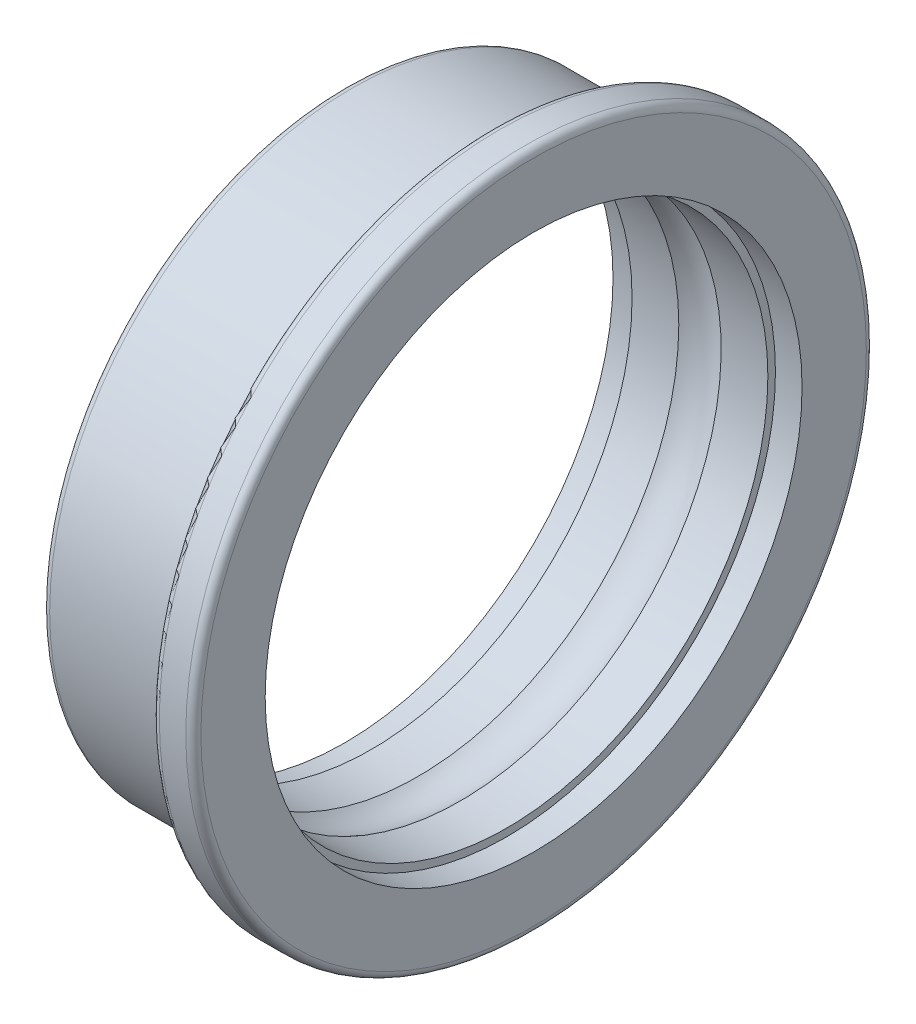
ISO-10303-21;
HEADER;
FILE_DESCRIPTION(('STEP AP214'),'2;1');
FILE_NAME('part.step','',(''),(''),'','','');
FILE_SCHEMA(('AUTOMOTIVE_DESIGN { 1 0 10303 214 1 1 1 1 }'));
ENDSEC;
DATA;
#1=APPLICATION_CONTEXT('core data for automotive mechanical design processes');
#2=APPLICATION_PROTOCOL_DEFINITION('international standard','automotive_design',2000,#1);
#3=PRODUCT_CONTEXT('',#1,'mechanical');
#4=PRODUCT('Part','Part','',(#3));
#5=PRODUCT_RELATED_PRODUCT_CATEGORY('part','',(#4));
#6=PRODUCT_DEFINITION_FORMATION('','',#4);
#7=PRODUCT_DEFINITION_CONTEXT('part definition',#1,'design');
#8=PRODUCT_DEFINITION('design','',#6,#7);
#9=PRODUCT_DEFINITION_SHAPE('','',#8);
#10=(LENGTH_UNIT() NAMED_UNIT(*) SI_UNIT(.MILLI.,.METRE.));
#11=(NAMED_UNIT(*) PLANE_ANGLE_UNIT() SI_UNIT($,.RADIAN.));
#12=(NAMED_UNIT(*) SI_UNIT($,.STERADIAN.) SOLID_ANGLE_UNIT());
#13=UNCERTAINTY_MEASURE_WITH_UNIT(LENGTH_MEASURE(1.E-05),#10,'distance_accuracy_value','');
#14=(GEOMETRIC_REPRESENTATION_CONTEXT(3) GLOBAL_UNCERTAINTY_ASSIGNED_CONTEXT((#13)) GLOBAL_UNIT_ASSIGNED_CONTEXT((#10,
#11,#12)) REPRESENTATION_CONTEXT('',''));
#15=CARTESIAN_POINT('',(0.,0.,0.));
#16=DIRECTION('',(0.,0.,1.));
#17=DIRECTION('',(1.,0.,0.));
#18=AXIS2_PLACEMENT_3D('',#15,#16,#17);
#19=CARTESIAN_POINT('',(4.296,0.,-7.));
#20=DIRECTION('',(1.,0.,0.));
#21=DIRECTION('',(0.,0.,-1.));
#22=AXIS2_PLACEMENT_3D('',#19,#20,#21);
#23=PLANE('',#22);
#24=CARTESIAN_POINT('',(4.296,0.,0.));
#25=DIRECTION('',(-1.,0.,0.));
#26=DIRECTION('',(0.,0.,1.));
#27=AXIS2_PLACEMENT_3D('',#24,#25,#26);
#28=CIRCLE('',#27,7.1);
#29=CARTESIAN_POINT('',(4.296,0.,7.1));
#30=VERTEX_POINT('',#29);
#31=EDGE_CURVE('E115',#30,#30,#28,.F.);
#32=ORIENTED_EDGE('',*,*,#31,.T.);
#33=EDGE_LOOP('',(#32));
#34=FACE_BOUND('',#33,.T.);
#35=CARTESIAN_POINT('',(4.296,0.,0.));
#36=DIRECTION('',(-1.,0.,0.));
#37=DIRECTION('',(0.,0.,1.));
#38=AXIS2_PLACEMENT_3D('',#35,#36,#37);
#39=CIRCLE('',#38,6.9);
#40=CARTESIAN_POINT('',(4.296,0.,6.9));
#41=VERTEX_POINT('',#40);
#42=EDGE_CURVE('E118',#41,#41,#39,.T.);
#43=ORIENTED_EDGE('',*,*,#42,.T.);
#44=EDGE_LOOP('',(#43));
#45=FACE_BOUND('',#44,.T.);
#46=ADVANCED_FACE('F17',(#34,#45),#23,.T.);
#47=CARTESIAN_POINT('',(3.67798113775753,0.,0.));
#48=DIRECTION('',(-1.,0.,0.));
#49=DIRECTION('',(0.,0.,1.));
#50=AXIS2_PLACEMENT_3D('',#47,#48,#49);
#51=CYLINDRICAL_SURFACE('',#50,6.9);
#52=CARTESIAN_POINT('',(3.05996227551506,0.,0.));
#53=DIRECTION('',(1.,0.,0.));
#54=DIRECTION('',(0.,1.,0.));
#55=AXIS2_PLACEMENT_3D('',#52,#53,#54);
#56=CIRCLE('',#55,6.9);
#57=CARTESIAN_POINT('',(3.05996227551506,6.9,0.));
#58=VERTEX_POINT('',#57);
#59=EDGE_CURVE('E73',#58,#58,#56,.F.);
#60=ORIENTED_EDGE('',*,*,#59,.T.);
#61=EDGE_LOOP('',(#60));
#62=FACE_BOUND('',#61,.T.);
#63=ORIENTED_EDGE('',*,*,#42,.F.);
#64=EDGE_LOOP('',(#63));
#65=FACE_BOUND('',#64,.T.);
#66=ADVANCED_FACE('F375',(#62,#65),#51,.F.);
#67=CARTESIAN_POINT('',(4.648,0.,0.));
#68=DIRECTION('',(-1.,0.,0.));
#69=DIRECTION('',(0.,0.,1.));
#70=AXIS2_PLACEMENT_3D('',#67,#68,#69);
#71=CYLINDRICAL_SURFACE('',#70,7.1);
#72=ORIENTED_EDGE('',*,*,#31,.F.);
#73=EDGE_LOOP('',(#72));
#74=FACE_BOUND('',#73,.T.);
#75=CARTESIAN_POINT('',(5.,0.,0.));
#76=DIRECTION('',(-1.,0.,0.));
#77=DIRECTION('',(0.,0.,1.));
#78=AXIS2_PLACEMENT_3D('',#75,#76,#77);
#79=CIRCLE('',#78,7.1);
#80=CARTESIAN_POINT('',(5.,0.,7.1));
#81=VERTEX_POINT('',#80);
#82=EDGE_CURVE('E59',#81,#81,#79,.T.);
#83=ORIENTED_EDGE('',*,*,#82,.F.);
#84=EDGE_LOOP('',(#83));
#85=FACE_BOUND('',#84,.T.);
#86=ADVANCED_FACE('F367',(#74,#85),#71,.F.);
#87=CARTESIAN_POINT('',(5.,0.,-7.95));
#88=DIRECTION('',(1.,0.,0.));
#89=DIRECTION('',(0.,0.,-1.));
#90=AXIS2_PLACEMENT_3D('',#87,#88,#89);
#91=PLANE('',#90);
#92=CARTESIAN_POINT('',(5.,0.,0.));
#93=DIRECTION('',(-1.,0.,0.));
#94=DIRECTION('',(0.,0.,1.));
#95=AXIS2_PLACEMENT_3D('',#92,#93,#94);
#96=CIRCLE('',#95,8.8);
#97=CARTESIAN_POINT('',(5.,0.,8.8));
#98=VERTEX_POINT('',#97);
#99=CARTESIAN_POINT('',(5.,0.,-8.8));
#100=VERTEX_POINT('',#99);
#101=EDGE_CURVE('E51',#98,#100,#96,.T.);
#102=ORIENTED_EDGE('',*,*,#101,.F.);
#103=CARTESIAN_POINT('',(5.,0.,0.));
#104=DIRECTION('',(-1.,0.,0.));
#105=DIRECTION('',(0.,0.,-1.));
#106=AXIS2_PLACEMENT_3D('',#103,#104,#105);
#107=CIRCLE('',#106,8.8);
#108=EDGE_CURVE('E57',#100,#98,#107,.T.);
#109=ORIENTED_EDGE('',*,*,#108,.F.);
#110=EDGE_LOOP('',(#102,#109));
#111=FACE_BOUND('',#110,.T.);
#112=ORIENTED_EDGE('',*,*,#82,.T.);
#113=EDGE_LOOP('',(#112));
#114=FACE_BOUND('',#113,.T.);
#115=ADVANCED_FACE('F55',(#111,#114),#91,.T.);
#116=CARTESIAN_POINT('',(2.5,0.,0.));
#117=DIRECTION('',(1.,0.,0.));
#118=DIRECTION('',(0.,1.,0.));
#119=AXIS2_PLACEMENT_3D('',#116,#117,#118);
#120=TOROIDAL_SURFACE('',#119,5.9625,1.092);
#121=ORIENTED_EDGE('',*,*,#59,.F.);
#122=EDGE_LOOP('',(#121));
#123=FACE_BOUND('',#122,.T.);
#124=CARTESIAN_POINT('',(1.94003772448494,0.,0.));
#125=DIRECTION('',(-1.,0.,0.));
#126=DIRECTION('',(0.,0.,1.));
#127=AXIS2_PLACEMENT_3D('',#124,#125,#126);
#128=CIRCLE('',#127,6.9);
#129=CARTESIAN_POINT('',(1.94003772448494,0.,6.9));
#130=VERTEX_POINT('',#129);
#131=EDGE_CURVE('E64',#130,#130,#128,.T.);
#132=ORIENTED_EDGE('',*,*,#131,.T.);
#133=EDGE_LOOP('',(#132));
#134=FACE_BOUND('',#133,.T.);
#135=ADVANCED_FACE('F86',(#123,#134),#120,.F.);
#136=CARTESIAN_POINT('',(4.8,0.,0.));
#137=DIRECTION('',(1.,0.,0.));
#138=DIRECTION('',(0.,1.,0.));
#139=AXIS2_PLACEMENT_3D('',#136,#137,#138);
#140=TOROIDAL_SURFACE('',#139,8.8,0.2);
#141=CARTESIAN_POINT('',(4.8,0.,0.));
#142=DIRECTION('',(-1.,0.,0.));
#143=DIRECTION('',(0.,0.,1.));
#144=AXIS2_PLACEMENT_3D('',#141,#142,#143);
#145=CIRCLE('',#144,9.);
#146=CARTESIAN_POINT('',(4.8,0.,9.));
#147=VERTEX_POINT('',#146);
#148=EDGE_CURVE('E93',#147,#147,#145,.T.);
#149=ORIENTED_EDGE('',*,*,#148,.F.);
#150=EDGE_LOOP('',(#149));
#151=FACE_BOUND('',#150,.T.);
#152=ORIENTED_EDGE('',*,*,#108,.T.);
#153=ORIENTED_EDGE('',*,*,#101,.T.);
#154=EDGE_LOOP('',(#152,#153));
#155=FACE_BOUND('',#154,.T.);
#156=ADVANCED_FACE('F63',(#151,#155),#140,.T.);
#157=CARTESIAN_POINT('',(1.32201886224247,0.,0.));
#158=DIRECTION('',(-1.,0.,0.));
#159=DIRECTION('',(0.,0.,1.));
#160=AXIS2_PLACEMENT_3D('',#157,#158,#159);
#161=CYLINDRICAL_SURFACE('',#160,6.9);
#162=CARTESIAN_POINT('',(0.704,0.,0.));
#163=DIRECTION('',(-1.,0.,0.));
#164=DIRECTION('',(0.,0.,1.));
#165=AXIS2_PLACEMENT_3D('',#162,#163,#164);
#166=CIRCLE('',#165,6.9);
#167=CARTESIAN_POINT('',(0.704,0.,6.9));
#168=VERTEX_POINT('',#167);
#169=EDGE_CURVE('E100',#168,#168,#166,.F.);
#170=ORIENTED_EDGE('',*,*,#169,.F.);
#171=EDGE_LOOP('',(#170));
#172=FACE_BOUND('',#171,.T.);
#173=ORIENTED_EDGE('',*,*,#131,.F.);
#174=EDGE_LOOP('',(#173));
#175=FACE_BOUND('',#174,.T.);
#176=ADVANCED_FACE('F85',(#172,#175),#161,.F.);
#177=CARTESIAN_POINT('',(4.45,0.,0.));
#178=DIRECTION('',(-1.,0.,0.));
#179=DIRECTION('',(0.,0.,1.));
#180=AXIS2_PLACEMENT_3D('',#177,#178,#179);
#181=CYLINDRICAL_SURFACE('',#180,9.);
#182=ORIENTED_EDGE('',*,*,#148,.T.);
#183=EDGE_LOOP('',(#182));
#184=FACE_BOUND('',#183,.T.);
#185=CARTESIAN_POINT('',(4.1,0.,0.));
#186=DIRECTION('',(1.,0.,0.));
#187=DIRECTION('',(0.,1.,0.));
#188=AXIS2_PLACEMENT_3D('',#185,#186,#187);
#189=CIRCLE('',#188,9.00000000000001);
#190=CARTESIAN_POINT('',(4.1,9.00000000000001,0.));
#191=VERTEX_POINT('',#190);
#192=EDGE_CURVE('E104',#191,#191,#189,.F.);
#193=ORIENTED_EDGE('',*,*,#192,.F.);
#194=EDGE_LOOP('',(#193));
#195=FACE_BOUND('',#194,.T.);
#196=ADVANCED_FACE('F234',(#184,#195),#181,.T.);
#197=CARTESIAN_POINT('',(0.704,0.,-7.));
#198=DIRECTION('',(-1.,0.,0.));
#199=DIRECTION('',(0.,0.,1.));
#200=AXIS2_PLACEMENT_3D('',#197,#198,#199);
#201=PLANE('',#200);
#202=ORIENTED_EDGE('',*,*,#169,.T.);
#203=EDGE_LOOP('',(#202));
#204=FACE_BOUND('',#203,.T.);
#205=CARTESIAN_POINT('',(0.704,0.,0.));
#206=DIRECTION('',(-1.,0.,0.));
#207=DIRECTION('',(0.,0.,1.));
#208=AXIS2_PLACEMENT_3D('',#205,#206,#207);
#209=CIRCLE('',#208,7.1);
#210=CARTESIAN_POINT('',(0.704,0.,7.1));
#211=VERTEX_POINT('',#210);
#212=EDGE_CURVE('E109',#211,#211,#209,.T.);
#213=ORIENTED_EDGE('',*,*,#212,.T.);
#214=EDGE_LOOP('',(#213));
#215=FACE_BOUND('',#214,.T.);
#216=ADVANCED_FACE('F216',(#204,#215),#201,.T.);
#217=CARTESIAN_POINT('',(4.1,0.,0.));
#218=DIRECTION('',(1.,0.,0.));
#219=DIRECTION('',(0.,1.,0.));
#220=AXIS2_PLACEMENT_3D('',#217,#218,#219);
#221=TOROIDAL_SURFACE('',#220,8.8,0.200000000000005);
#222=CARTESIAN_POINT('',(3.89999999999999,0.,0.));
#223=DIRECTION('',(1.,0.,0.));
#224=DIRECTION('',(0.,0.,-1.));
#225=AXIS2_PLACEMENT_3D('',#222,#223,#224);
#226=CIRCLE('',#225,8.8);
#227=CARTESIAN_POINT('',(3.9,0.,8.8));
#228=VERTEX_POINT('',#227);
#229=CARTESIAN_POINT('',(3.9,0.,-8.8));
#230=VERTEX_POINT('',#229);
#231=EDGE_CURVE('E183',#228,#230,#226,.F.);
#232=ORIENTED_EDGE('',*,*,#231,.F.);
#233=CARTESIAN_POINT('',(3.89999999999999,0.,0.));
#234=DIRECTION('',(1.,0.,0.));
#235=DIRECTION('',(0.,0.,1.));
#236=AXIS2_PLACEMENT_3D('',#233,#234,#235);
#237=CIRCLE('',#236,8.8);
#238=EDGE_CURVE('E260',#230,#228,#237,.F.);
#239=ORIENTED_EDGE('',*,*,#238,.F.);
#240=EDGE_LOOP('',(#232,#239));
#241=FACE_BOUND('',#240,.T.);
#242=ORIENTED_EDGE('',*,*,#192,.T.);
#243=EDGE_LOOP('',(#242));
#244=FACE_BOUND('',#243,.T.);
#245=ADVANCED_FACE('F212',(#241,#244),#221,.T.);
#246=CARTESIAN_POINT('',(0.352,0.,0.));
#247=DIRECTION('',(-1.,0.,0.));
#248=DIRECTION('',(0.,0.,1.));
#249=AXIS2_PLACEMENT_3D('',#246,#247,#248);
#250=CYLINDRICAL_SURFACE('',#249,7.1);
#251=CARTESIAN_POINT('',(0.,0.,0.));
#252=DIRECTION('',(-1.,0.,0.));
#253=DIRECTION('',(0.,0.,1.));
#254=AXIS2_PLACEMENT_3D('',#251,#252,#253);
#255=CIRCLE('',#254,7.1);
#256=CARTESIAN_POINT('',(0.,0.,7.1));
#257=VERTEX_POINT('',#256);
#258=EDGE_CURVE('E258',#257,#257,#255,.F.);
#259=ORIENTED_EDGE('',*,*,#258,.F.);
#260=EDGE_LOOP('',(#259));
#261=FACE_BOUND('',#260,.T.);
#262=ORIENTED_EDGE('',*,*,#212,.F.);
#263=EDGE_LOOP('',(#262));
#264=FACE_BOUND('',#263,.T.);
#265=ADVANCED_FACE('F197',(#261,#264),#250,.F.);
#266=CARTESIAN_POINT('',(3.9,0.,-8.45));
#267=DIRECTION('',(-1.,0.,0.));
#268=DIRECTION('',(0.,0.,1.));
#269=AXIS2_PLACEMENT_3D('',#266,#267,#268);
#270=PLANE('',#269);
#271=CARTESIAN_POINT('',(3.9,0.,0.));
#272=DIRECTION('',(1.,0.,0.));
#273=DIRECTION('',(0.,0.,-1.));
#274=AXIS2_PLACEMENT_3D('',#271,#272,#273);
#275=CIRCLE('',#274,8.0999999999);
#276=CARTESIAN_POINT('',(3.9,0.,-8.0999999999));
#277=VERTEX_POINT('',#276);
#278=EDGE_CURVE('E257',#277,#277,#275,.T.);
#279=ORIENTED_EDGE('',*,*,#278,.T.);
#280=EDGE_LOOP('',(#279));
#281=FACE_BOUND('',#280,.T.);
#282=ORIENTED_EDGE('',*,*,#231,.T.);
#283=ORIENTED_EDGE('',*,*,#238,.T.);
#284=EDGE_LOOP('',(#282,#283));
#285=FACE_BOUND('',#284,.T.);
#286=ADVANCED_FACE('F188',(#281,#285),#270,.T.);
#287=CARTESIAN_POINT('',(0.,0.,-7.45));
#288=DIRECTION('',(-1.,0.,0.));
#289=DIRECTION('',(0.,0.,1.));
#290=AXIS2_PLACEMENT_3D('',#287,#288,#289);
#291=PLANE('',#290);
#292=ORIENTED_EDGE('',*,*,#258,.T.);
#293=EDGE_LOOP('',(#292));
#294=FACE_BOUND('',#293,.T.);
#295=CARTESIAN_POINT('',(0.,0.,0.));
#296=DIRECTION('',(1.,0.,0.));
#297=DIRECTION('',(0.,0.,-1.));
#298=AXIS2_PLACEMENT_3D('',#295,#296,#297);
#299=CIRCLE('',#298,7.8);
#300=CARTESIAN_POINT('',(0.,0.,-7.8));
#301=VERTEX_POINT('',#300);
#302=CARTESIAN_POINT('',(0.,0.,7.8));
#303=VERTEX_POINT('',#302);
#304=EDGE_CURVE('E151',#301,#303,#299,.T.);
#305=ORIENTED_EDGE('',*,*,#304,.F.);
#306=CARTESIAN_POINT('',(0.,0.,0.));
#307=DIRECTION('',(1.,0.,0.));
#308=DIRECTION('',(0.,0.,1.));
#309=AXIS2_PLACEMENT_3D('',#306,#307,#308);
#310=CIRCLE('',#309,7.8);
#311=EDGE_CURVE('E36',#303,#301,#310,.T.);
#312=ORIENTED_EDGE('',*,*,#311,.F.);
#313=EDGE_LOOP('',(#305,#312));
#314=FACE_BOUND('',#313,.T.);
#315=ADVANCED_FACE('F138',(#294,#314),#291,.T.);
#316=CARTESIAN_POINT('',(0.199999999999999,0.,0.));
#317=DIRECTION('',(1.,0.,0.));
#318=DIRECTION('',(0.,1.,0.));
#319=AXIS2_PLACEMENT_3D('',#316,#317,#318);
#320=TOROIDAL_SURFACE('',#319,7.8,0.199999999999999);
#321=CARTESIAN_POINT('',(0.2,0.,0.));
#322=DIRECTION('',(-1.,0.,0.));
#323=DIRECTION('',(0.,0.,1.));
#324=AXIS2_PLACEMENT_3D('',#321,#322,#323);
#325=CIRCLE('',#324,8.);
#326=CARTESIAN_POINT('',(0.2,0.,8.));
#327=VERTEX_POINT('',#326);
#328=EDGE_CURVE('E28',#327,#327,#325,.F.);
#329=ORIENTED_EDGE('',*,*,#328,.F.);
#330=EDGE_LOOP('',(#329));
#331=FACE_BOUND('',#330,.T.);
#332=ORIENTED_EDGE('',*,*,#304,.T.);
#333=ORIENTED_EDGE('',*,*,#311,.T.);
#334=EDGE_LOOP('',(#332,#333));
#335=FACE_BOUND('',#334,.T.);
#336=ADVANCED_FACE('F126',(#331,#335),#320,.T.);
#337=CARTESIAN_POINT('',(3.9000000001,0.,0.));
#338=DIRECTION('',(1.,0.,0.));
#339=DIRECTION('',(0.,1.,0.));
#340=AXIS2_PLACEMENT_3D('',#337,#338,#339);
#341=TOROIDAL_SURFACE('',#340,7.9999999999,0.1);
#342=ORIENTED_EDGE('',*,*,#278,.F.);
#343=EDGE_LOOP('',(#342));
#344=FACE_BOUND('',#343,.T.);
#345=CARTESIAN_POINT('',(3.8000000001,0.,0.));
#346=DIRECTION('',(-1.,0.,0.));
#347=DIRECTION('',(0.,0.,1.));
#348=AXIS2_PLACEMENT_3D('',#345,#346,#347);
#349=CIRCLE('',#348,8.);
#350=CARTESIAN_POINT('',(3.8000000001,0.,8.));
#351=VERTEX_POINT('',#350);
#352=EDGE_CURVE('E11',#351,#351,#349,.T.);
#353=ORIENTED_EDGE('',*,*,#352,.F.);
#354=EDGE_LOOP('',(#353));
#355=FACE_BOUND('',#354,.T.);
#356=ADVANCED_FACE('F137',(#344,#355),#341,.F.);
#357=CARTESIAN_POINT('',(2.00000000005,0.,0.));
#358=DIRECTION('',(-1.,0.,0.));
#359=DIRECTION('',(0.,0.,1.));
#360=AXIS2_PLACEMENT_3D('',#357,#358,#359);
#361=CYLINDRICAL_SURFACE('',#360,8.);
#362=ORIENTED_EDGE('',*,*,#328,.T.);
#363=EDGE_LOOP('',(#362));
#364=FACE_BOUND('',#363,.T.);
#365=ORIENTED_EDGE('',*,*,#352,.T.);
#366=EDGE_LOOP('',(#365));
#367=FACE_BOUND('',#366,.T.);
#368=ADVANCED_FACE('F242',(#364,#367),#361,.T.);
#369=CLOSED_SHELL('',(#46,#66,#86,#115,#135,#156,#176,#196,#216,#245,#265,#286,#315,#336,#356,#368));
#370=MANIFOLD_SOLID_BREP('B1',#369);
#371=ADVANCED_BREP_SHAPE_REPRESENTATION('',(#18,#370),#14);
#372=SHAPE_DEFINITION_REPRESENTATION(#9,#371);
ENDSEC;
END-ISO-10303-21;
